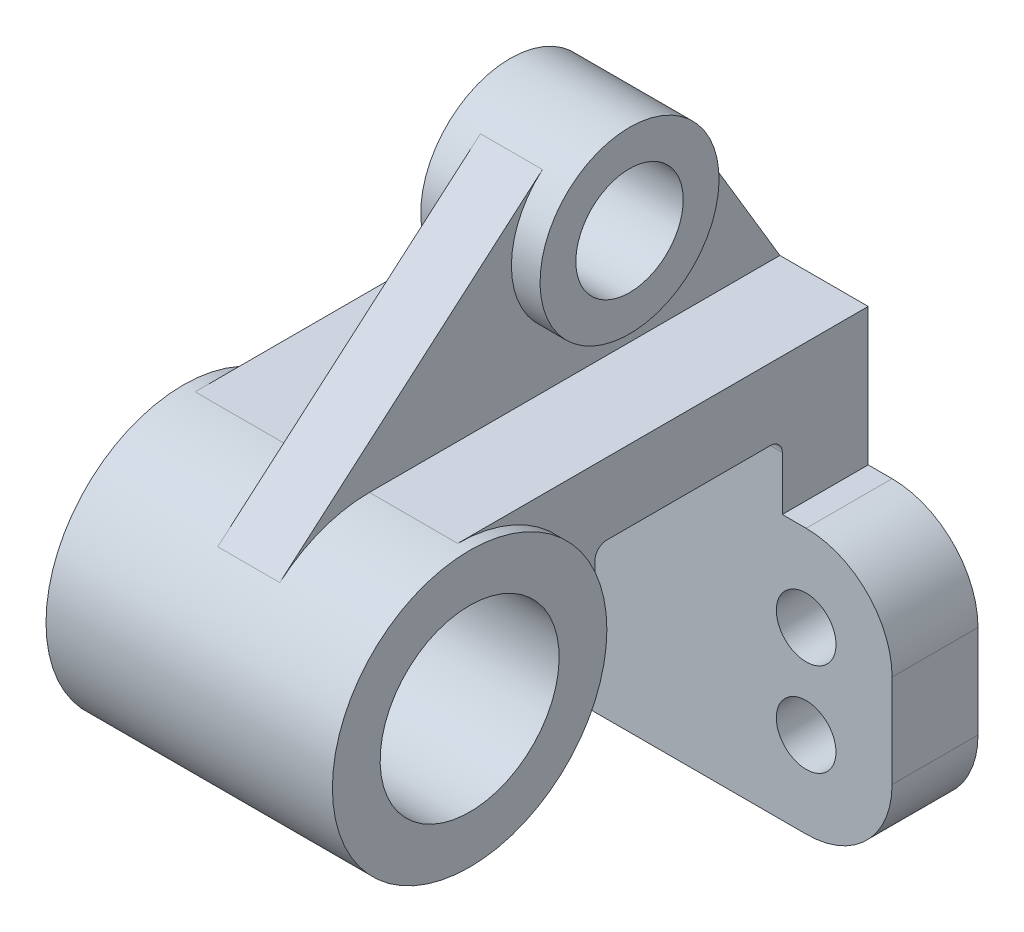
ISO-10303-21;
HEADER;
FILE_DESCRIPTION(('STEP AP214'),'2;1');
FILE_NAME('part.step','',(''),(''),'','','');
FILE_SCHEMA(('AUTOMOTIVE_DESIGN { 1 0 10303 214 1 1 1 1 }'));
ENDSEC;
DATA;
#1=APPLICATION_CONTEXT('core data for automotive mechanical design processes');
#2=APPLICATION_PROTOCOL_DEFINITION('international standard','automotive_design',2000,#1);
#3=PRODUCT_CONTEXT('',#1,'mechanical');
#4=PRODUCT('Part','Part','',(#3));
#5=PRODUCT_RELATED_PRODUCT_CATEGORY('part','',(#4));
#6=PRODUCT_DEFINITION_FORMATION('','',#4);
#7=PRODUCT_DEFINITION_CONTEXT('part definition',#1,'design');
#8=PRODUCT_DEFINITION('design','',#6,#7);
#9=PRODUCT_DEFINITION_SHAPE('','',#8);
#10=(LENGTH_UNIT() NAMED_UNIT(*) SI_UNIT(.MILLI.,.METRE.));
#11=(NAMED_UNIT(*) PLANE_ANGLE_UNIT() SI_UNIT($,.RADIAN.));
#12=(NAMED_UNIT(*) SI_UNIT($,.STERADIAN.) SOLID_ANGLE_UNIT());
#13=UNCERTAINTY_MEASURE_WITH_UNIT(LENGTH_MEASURE(1.E-05),#10,'distance_accuracy_value','');
#14=(GEOMETRIC_REPRESENTATION_CONTEXT(3) GLOBAL_UNCERTAINTY_ASSIGNED_CONTEXT((#13)) GLOBAL_UNIT_ASSIGNED_CONTEXT((#10,
#11,#12)) REPRESENTATION_CONTEXT('',''));
#15=CARTESIAN_POINT('',(0.,0.,0.));
#16=DIRECTION('',(0.,0.,1.));
#17=DIRECTION('',(1.,0.,0.));
#18=AXIS2_PLACEMENT_3D('',#15,#16,#17);
#19=CARTESIAN_POINT('',(-408.345479395829,-1118.04158059099,628.051528257977));
#20=DIRECTION('',(-1.,0.,0.));
#21=DIRECTION('',(0.,0.,1.));
#22=AXIS2_PLACEMENT_3D('',#19,#20,#21);
#23=PLANE('',#22);
#24=CARTESIAN_POINT('',(-408.345479395829,-1118.04158059099,628.051528257977));
#25=DIRECTION('',(-1.,0.,0.));
#26=DIRECTION('',(0.,-1.,0.));
#27=AXIS2_PLACEMENT_3D('',#24,#25,#26);
#28=CIRCLE('',#27,37.5);
#29=CARTESIAN_POINT('',(-408.345479395829,-1080.54158059099,628.051528257977));
#30=VERTEX_POINT('',#29);
#31=EDGE_CURVE('E181',#30,#30,#28,.T.);
#32=ORIENTED_EDGE('',*,*,#31,.F.);
#33=EDGE_LOOP('',(#32));
#34=FACE_BOUND('',#33,.T.);
#35=CARTESIAN_POINT('',(-408.345479395829,-1118.04158059099,628.051528257977));
#36=DIRECTION('',(1.,0.,0.));
#37=DIRECTION('',(0.,1.,0.));
#38=AXIS2_PLACEMENT_3D('',#35,#36,#37);
#39=CIRCLE('',#38,22.5);
#40=CARTESIAN_POINT('',(-408.345479395829,-1140.54158059099,628.051528257977));
#41=VERTEX_POINT('',#40);
#42=EDGE_CURVE('E10',#41,#41,#39,.T.);
#43=ORIENTED_EDGE('',*,*,#42,.F.);
#44=EDGE_LOOP('',(#43));
#45=FACE_BOUND('',#44,.T.);
#46=ADVANCED_FACE('F16',(#34,#45),#23,.F.);
#47=CARTESIAN_POINT('',(-458.345479395829,-1118.04158059099,628.051528257977));
#48=DIRECTION('',(-1.,0.,0.));
#49=DIRECTION('',(0.,0.,1.));
#50=AXIS2_PLACEMENT_3D('',#47,#48,#49);
#51=PLANE('',#50);
#52=CARTESIAN_POINT('',(-458.345479395829,-1118.04158059099,628.051528257977));
#53=DIRECTION('',(-1.,0.,0.));
#54=DIRECTION('',(0.,1.,0.));
#55=AXIS2_PLACEMENT_3D('',#52,#53,#54);
#56=CIRCLE('',#55,37.5);
#57=CARTESIAN_POINT('',(-458.345479395829,-1080.54158059099,628.051528257977));
#58=VERTEX_POINT('',#57);
#59=EDGE_CURVE('E180',#58,#58,#56,.T.);
#60=ORIENTED_EDGE('',*,*,#59,.T.);
#61=EDGE_LOOP('',(#60));
#62=FACE_BOUND('',#61,.T.);
#63=CARTESIAN_POINT('',(-458.345479395829,-1118.04158059099,628.051528257977));
#64=DIRECTION('',(1.,0.,0.));
#65=DIRECTION('',(0.,1.,0.));
#66=AXIS2_PLACEMENT_3D('',#63,#64,#65);
#67=CIRCLE('',#66,22.5);
#68=CARTESIAN_POINT('',(-458.345479395829,-1140.54158059099,628.051528257977));
#69=VERTEX_POINT('',#68);
#70=EDGE_CURVE('E25',#69,#69,#67,.T.);
#71=ORIENTED_EDGE('',*,*,#70,.T.);
#72=EDGE_LOOP('',(#71));
#73=FACE_BOUND('',#72,.T.);
#74=ADVANCED_FACE('F178',(#62,#73),#51,.T.);
#75=CARTESIAN_POINT('',(-408.345479395829,-1118.04158059099,628.051528257977));
#76=DIRECTION('',(1.,0.,0.));
#77=DIRECTION('',(0.,1.,0.));
#78=AXIS2_PLACEMENT_3D('',#75,#76,#77);
#79=CYLINDRICAL_SURFACE('',#78,22.5);
#80=ORIENTED_EDGE('',*,*,#42,.T.);
#81=EDGE_LOOP('',(#80));
#82=FACE_BOUND('',#81,.T.);
#83=ORIENTED_EDGE('',*,*,#70,.F.);
#84=EDGE_LOOP('',(#83));
#85=FACE_BOUND('',#84,.T.);
#86=ADVANCED_FACE('F555',(#82,#85),#79,.F.);
#87=CARTESIAN_POINT('',(-408.345479395829,-1118.04158059099,628.051528257977));
#88=DIRECTION('',(1.,0.,0.));
#89=DIRECTION('',(0.,-1.,0.));
#90=AXIS2_PLACEMENT_3D('',#87,#88,#89);
#91=CYLINDRICAL_SURFACE('',#90,37.5);
#92=DIRECTION('',(-1.,0.,0.));
#93=VECTOR('',#92,1.);
#94=CARTESIAN_POINT('',(-408.345479395829,-1089.63532876995,652.532844756065));
#95=LINE('',#94,#93);
#96=CARTESIAN_POINT('',(-420.345479395829,-1089.63532876995,652.532844756065));
#97=VERTEX_POINT('',#96);
#98=CARTESIAN_POINT('',(-446.345479395829,-1089.63532876995,652.532844756065));
#99=VERTEX_POINT('',#98);
#100=EDGE_CURVE('E196',#97,#99,#95,.T.);
#101=ORIENTED_EDGE('',*,*,#100,.F.);
#102=CARTESIAN_POINT('',(-420.345479395829,-1118.04158059099,628.051528257977));
#103=DIRECTION('',(1.,0.,0.));
#104=DIRECTION('',(0.,-1.,0.));
#105=AXIS2_PLACEMENT_3D('',#102,#103,#104);
#106=CIRCLE('',#105,37.5);
#107=CARTESIAN_POINT('',(-420.345479395829,-1098.82464587876,595.849673959415));
#108=VERTEX_POINT('',#107);
#109=EDGE_CURVE('E188',#97,#108,#106,.T.);
#110=ORIENTED_EDGE('',*,*,#109,.T.);
#111=DIRECTION('',(-1.,0.,0.));
#112=VECTOR('',#111,1.);
#113=CARTESIAN_POINT('',(-408.345479395829,-1098.82464587876,595.849673959415));
#114=LINE('',#113,#112);
#115=CARTESIAN_POINT('',(-446.345479395829,-1098.82464587876,595.849673959415));
#116=VERTEX_POINT('',#115);
#117=EDGE_CURVE('E274',#108,#116,#114,.T.);
#118=ORIENTED_EDGE('',*,*,#117,.T.);
#119=CARTESIAN_POINT('',(-446.345479395829,-1118.04158059099,628.051528257977));
#120=DIRECTION('',(-1.,0.,0.));
#121=DIRECTION('',(0.,-1.,0.));
#122=AXIS2_PLACEMENT_3D('',#119,#120,#121);
#123=CIRCLE('',#122,37.5);
#124=EDGE_CURVE('E191',#116,#99,#123,.T.);
#125=ORIENTED_EDGE('',*,*,#124,.T.);
#126=EDGE_LOOP('',(#101,#110,#118,#125));
#127=FACE_BOUND('',#126,.T.);
#128=ORIENTED_EDGE('',*,*,#59,.F.);
#129=EDGE_LOOP('',(#128));
#130=FACE_BOUND('',#129,.T.);
#131=ORIENTED_EDGE('',*,*,#31,.T.);
#132=EDGE_LOOP('',(#131));
#133=FACE_BOUND('',#132,.T.);
#134=ADVANCED_FACE('F556',(#127,#130,#133),#91,.T.);
#135=CARTESIAN_POINT('',(-420.345479395829,-1147.60960612174,650.948440116478));
#136=DIRECTION('',(1.,0.,0.));
#137=DIRECTION('',(0.,0.,-1.));
#138=AXIS2_PLACEMENT_3D('',#135,#136,#137);
#139=PLANE('',#138);
#140=CARTESIAN_POINT('',(-420.345479395829,-1228.041580591,725.051528257977));
#141=DIRECTION('',(1.,0.,0.));
#142=DIRECTION('',(0.,1.,0.));
#143=AXIS2_PLACEMENT_3D('',#140,#141,#142);
#144=CIRCLE('',#143,57.5000000000011);
#145=CARTESIAN_POINT('',(-420.345479395829,-1170.54158059099,725.051528257977));
#146=VERTEX_POINT('',#145);
#147=CARTESIAN_POINT('',(-420.345479395829,-1184.48532779873,762.589546888379));
#148=VERTEX_POINT('',#147);
#149=EDGE_CURVE('E288',#146,#148,#144,.T.);
#150=ORIENTED_EDGE('',*,*,#149,.F.);
#151=DIRECTION('',(0.,0.,1.));
#152=VECTOR('',#151,1.);
#153=CARTESIAN_POINT('',(-420.345479395829,-1170.54158059099,553.051528257977));
#154=LINE('',#153,#152);
#155=CARTESIAN_POINT('',(-420.345479395829,-1170.54158059099,553.051528257977));
#156=VERTEX_POINT('',#155);
#157=EDGE_CURVE('E267',#156,#146,#154,.T.);
#158=ORIENTED_EDGE('',*,*,#157,.F.);
#159=DIRECTION('',(0.,-0.858716114628324,-0.512451592326178));
#160=VECTOR('',#159,1.);
#161=CARTESIAN_POINT('',(-420.345479395829,-1098.82464587876,595.849673959415));
#162=LINE('',#161,#160);
#163=EDGE_CURVE('E339',#108,#156,#162,.T.);
#164=ORIENTED_EDGE('',*,*,#163,.F.);
#165=ORIENTED_EDGE('',*,*,#109,.F.);
#166=DIRECTION('',(0.,0.65283510661569,-0.757500048561108));
#167=VECTOR('',#166,1.);
#168=CARTESIAN_POINT('',(-420.345479395829,-1184.48532779873,762.589546888379));
#169=LINE('',#168,#167);
#170=EDGE_CURVE('E205',#148,#97,#169,.T.);
#171=ORIENTED_EDGE('',*,*,#170,.F.);
#172=EDGE_LOOP('',(#150,#158,#164,#165,#171));
#173=FACE_BOUND('',#172,.T.);
#174=ADVANCED_FACE('F559',(#173),#139,.T.);
#175=CARTESIAN_POINT('',(-446.345479395829,-1147.60960612174,650.948440116478));
#176=DIRECTION('',(1.,0.,0.));
#177=DIRECTION('',(0.,0.,-1.));
#178=AXIS2_PLACEMENT_3D('',#175,#176,#177);
#179=PLANE('',#178);
#180=CARTESIAN_POINT('',(-446.345479395829,-1228.041580591,725.051528257977));
#181=DIRECTION('',(1.,0.,0.));
#182=DIRECTION('',(0.,1.,0.));
#183=AXIS2_PLACEMENT_3D('',#180,#181,#182);
#184=CIRCLE('',#183,57.5000000000011);
#185=CARTESIAN_POINT('',(-446.345479395829,-1170.54158059099,725.051528257977));
#186=VERTEX_POINT('',#185);
#187=CARTESIAN_POINT('',(-446.345479395829,-1184.48532779873,762.589546888379));
#188=VERTEX_POINT('',#187);
#189=EDGE_CURVE('E313',#186,#188,#184,.T.);
#190=ORIENTED_EDGE('',*,*,#189,.T.);
#191=DIRECTION('',(0.,0.65283510661569,-0.757500048561108));
#192=VECTOR('',#191,1.);
#193=CARTESIAN_POINT('',(-446.345479395829,-1184.48532779873,762.589546888379));
#194=LINE('',#193,#192);
#195=EDGE_CURVE('E197',#188,#99,#194,.T.);
#196=ORIENTED_EDGE('',*,*,#195,.T.);
#197=ORIENTED_EDGE('',*,*,#124,.F.);
#198=DIRECTION('',(0.,-0.858716114628324,-0.512451592326178));
#199=VECTOR('',#198,1.);
#200=CARTESIAN_POINT('',(-446.345479395829,-1098.82464587876,595.849673959415));
#201=LINE('',#200,#199);
#202=CARTESIAN_POINT('',(-446.345479395829,-1170.54158059099,553.051528257977));
#203=VERTEX_POINT('',#202);
#204=EDGE_CURVE('E384',#116,#203,#201,.T.);
#205=ORIENTED_EDGE('',*,*,#204,.T.);
#206=DIRECTION('',(0.,0.,1.));
#207=VECTOR('',#206,1.);
#208=CARTESIAN_POINT('',(-446.345479395829,-1170.54158059099,553.051528257977));
#209=LINE('',#208,#207);
#210=EDGE_CURVE('E279',#203,#186,#209,.T.);
#211=ORIENTED_EDGE('',*,*,#210,.T.);
#212=EDGE_LOOP('',(#190,#196,#197,#205,#211));
#213=FACE_BOUND('',#212,.T.);
#214=ADVANCED_FACE('F562',(#213),#179,.F.);
#215=CARTESIAN_POINT('',(-420.345479395829,-1184.48532779873,762.589546888379));
#216=DIRECTION('',(0.,0.757500048561107,0.65283510661569));
#217=DIRECTION('',(0.,0.65283510661569,-0.757500048561107));
#218=AXIS2_PLACEMENT_3D('',#215,#216,#217);
#219=PLANE('',#218);
#220=ORIENTED_EDGE('',*,*,#170,.T.);
#221=ORIENTED_EDGE('',*,*,#100,.T.);
#222=ORIENTED_EDGE('',*,*,#195,.F.);
#223=DIRECTION('',(-1.,0.,0.));
#224=VECTOR('',#223,1.);
#225=CARTESIAN_POINT('',(-420.345479395829,-1184.48532779873,762.589546888379));
#226=LINE('',#225,#224);
#227=EDGE_CURVE('E312',#148,#188,#226,.T.);
#228=ORIENTED_EDGE('',*,*,#227,.F.);
#229=EDGE_LOOP('',(#220,#221,#222,#228));
#230=FACE_BOUND('',#229,.T.);
#231=ADVANCED_FACE('F569',(#230),#219,.T.);
#232=CARTESIAN_POINT('',(-420.345479395829,-1098.82464587876,595.849673959415));
#233=DIRECTION('',(0.,0.512451592326178,-0.858716114628324));
#234=DIRECTION('',(0.,-0.858716114628324,-0.512451592326178));
#235=AXIS2_PLACEMENT_3D('',#232,#233,#234);
#236=PLANE('',#235);
#237=ORIENTED_EDGE('',*,*,#163,.T.);
#238=DIRECTION('',(-1.,0.,0.));
#239=VECTOR('',#238,1.);
#240=CARTESIAN_POINT('',(-420.345479395829,-1170.54158059099,553.051528257977));
#241=LINE('',#240,#239);
#242=EDGE_CURVE('E349',#156,#203,#241,.T.);
#243=ORIENTED_EDGE('',*,*,#242,.T.);
#244=ORIENTED_EDGE('',*,*,#204,.F.);
#245=ORIENTED_EDGE('',*,*,#117,.F.);
#246=EDGE_LOOP('',(#237,#243,#244,#245));
#247=FACE_BOUND('',#246,.T.);
#248=ADVANCED_FACE('F572',(#247),#236,.T.);
#249=CARTESIAN_POINT('',(-337.345479395829,-1339.04158059099,553.051528257977));
#250=DIRECTION('',(0.,-1.,0.));
#251=DIRECTION('',(0.,0.,1.));
#252=AXIS2_PLACEMENT_3D('',#249,#250,#251);
#253=PLANE('',#252);
#254=DIRECTION('',(0.,0.,-1.));
#255=VECTOR('',#254,1.);
#256=CARTESIAN_POINT('',(-373.345479395829,-1339.04158059099,562.051528257977));
#257=LINE('',#256,#255);
#258=CARTESIAN_POINT('',(-373.345479395829,-1339.04158059099,589.051528257977));
#259=VERTEX_POINT('',#258);
#260=CARTESIAN_POINT('',(-373.345479395829,-1339.04158059099,553.051528257977));
#261=VERTEX_POINT('',#260);
#262=EDGE_CURVE('E219',#259,#261,#257,.T.);
#263=ORIENTED_EDGE('',*,*,#262,.F.);
#264=DIRECTION('',(-1.,0.,0.));
#265=VECTOR('',#264,1.);
#266=CARTESIAN_POINT('',(-337.345479395829,-1339.04158059099,589.051528257977));
#267=LINE('',#266,#265);
#268=CARTESIAN_POINT('',(-493.345479395829,-1339.04158059099,589.051528257977));
#269=VERTEX_POINT('',#268);
#270=EDGE_CURVE('E210',#259,#269,#267,.T.);
#271=ORIENTED_EDGE('',*,*,#270,.T.);
#272=DIRECTION('',(0.,0.,1.));
#273=VECTOR('',#272,1.);
#274=CARTESIAN_POINT('',(-493.345479395829,-1339.04158059099,562.051528257977));
#275=LINE('',#274,#273);
#276=CARTESIAN_POINT('',(-493.345479395829,-1339.04158059099,553.051528257977));
#277=VERTEX_POINT('',#276);
#278=EDGE_CURVE('E206',#277,#269,#275,.T.);
#279=ORIENTED_EDGE('',*,*,#278,.F.);
#280=DIRECTION('',(-1.,0.,0.));
#281=VECTOR('',#280,1.);
#282=CARTESIAN_POINT('',(-337.345479395829,-1339.04158059099,553.051528257977));
#283=LINE('',#282,#281);
#284=EDGE_CURVE('E386',#261,#277,#283,.T.);
#285=ORIENTED_EDGE('',*,*,#284,.F.);
#286=EDGE_LOOP('',(#263,#271,#279,#285));
#287=FACE_BOUND('',#286,.T.);
#288=ADVANCED_FACE('F580',(#287),#253,.T.);
#289=CARTESIAN_POINT('',(-337.345479395829,-1228.04158059099,589.051528257977));
#290=DIRECTION('',(0.,1.,0.));
#291=DIRECTION('',(0.,0.,-1.));
#292=AXIS2_PLACEMENT_3D('',#289,#290,#291);
#293=PLANE('',#292);
#294=DIRECTION('',(0.,0.,1.));
#295=VECTOR('',#294,1.);
#296=CARTESIAN_POINT('',(-373.345479395829,-1228.04158059099,580.051528257977));
#297=LINE('',#296,#295);
#298=CARTESIAN_POINT('',(-373.345479395829,-1228.04158059099,553.051528257977));
#299=VERTEX_POINT('',#298);
#300=CARTESIAN_POINT('',(-373.345479395829,-1228.04158059099,589.051528257977));
#301=VERTEX_POINT('',#300);
#302=EDGE_CURVE('E414',#299,#301,#297,.T.);
#303=ORIENTED_EDGE('',*,*,#302,.F.);
#304=DIRECTION('',(-1.,0.,0.));
#305=VECTOR('',#304,1.);
#306=CARTESIAN_POINT('',(-337.345479395829,-1228.04158059099,553.051528257977));
#307=LINE('',#306,#305);
#308=CARTESIAN_POINT('',(-383.345479395829,-1228.04158059099,553.051528257977));
#309=VERTEX_POINT('',#308);
#310=EDGE_CURVE('E333',#299,#309,#307,.T.);
#311=ORIENTED_EDGE('',*,*,#310,.T.);
#312=DIRECTION('',(0.,0.,1.));
#313=VECTOR('',#312,1.);
#314=CARTESIAN_POINT('',(-383.345479395829,-1228.04158059099,608.169832847086));
#315=LINE('',#314,#313);
#316=CARTESIAN_POINT('',(-383.345479395829,-1228.04158059099,589.051528257977));
#317=VERTEX_POINT('',#316);
#318=EDGE_CURVE('E222',#309,#317,#315,.T.);
#319=ORIENTED_EDGE('',*,*,#318,.T.);
#320=DIRECTION('',(-1.,0.,0.));
#321=VECTOR('',#320,1.);
#322=CARTESIAN_POINT('',(-337.345479395829,-1228.04158059099,589.051528257977));
#323=LINE('',#322,#321);
#324=EDGE_CURVE('E215',#301,#317,#323,.T.);
#325=ORIENTED_EDGE('',*,*,#324,.F.);
#326=EDGE_LOOP('',(#303,#311,#319,#325));
#327=FACE_BOUND('',#326,.T.);
#328=ADVANCED_FACE('F583',(#327),#293,.T.);
#329=CARTESIAN_POINT('',(-493.345479395829,-1303.04158059099,562.051528257977));
#330=DIRECTION('',(0.,0.,-1.));
#331=DIRECTION('',(-0.707106781186548,-0.707106781186548,0.));
#332=AXIS2_PLACEMENT_3D('',#329,#330,#331);
#333=CYLINDRICAL_SURFACE('',#332,36.);
#334=CARTESIAN_POINT('',(-493.345479395829,-1303.04158059099,589.051528257977));
#335=DIRECTION('',(0.,0.,-1.));
#336=DIRECTION('',(-0.707106781186548,-0.707106781186548,0.));
#337=AXIS2_PLACEMENT_3D('',#334,#335,#336);
#338=CIRCLE('',#337,36.);
#339=CARTESIAN_POINT('',(-529.345479395829,-1303.04158059099,589.051528257977));
#340=VERTEX_POINT('',#339);
#341=EDGE_CURVE('E211',#269,#340,#338,.T.);
#342=ORIENTED_EDGE('',*,*,#341,.T.);
#343=DIRECTION('',(0.,0.,-1.));
#344=VECTOR('',#343,1.);
#345=CARTESIAN_POINT('',(-529.345479395829,-1303.04158059099,562.051528257977));
#346=LINE('',#345,#344);
#347=CARTESIAN_POINT('',(-529.345479395829,-1303.04158059099,553.051528257977));
#348=VERTEX_POINT('',#347);
#349=EDGE_CURVE('E201',#340,#348,#346,.T.);
#350=ORIENTED_EDGE('',*,*,#349,.T.);
#351=CARTESIAN_POINT('',(-493.345479395829,-1303.04158059099,553.051528257977));
#352=DIRECTION('',(0.,0.,1.));
#353=DIRECTION('',(-0.707106781186548,-0.707106781186548,0.));
#354=AXIS2_PLACEMENT_3D('',#351,#352,#353);
#355=CIRCLE('',#354,36.);
#356=EDGE_CURVE('E381',#348,#277,#355,.T.);
#357=ORIENTED_EDGE('',*,*,#356,.T.);
#358=ORIENTED_EDGE('',*,*,#278,.T.);
#359=EDGE_LOOP('',(#342,#350,#357,#358));
#360=FACE_BOUND('',#359,.T.);
#361=ADVANCED_FACE('F584',(#360),#333,.T.);
#362=CARTESIAN_POINT('',(-529.345479395829,-1283.54158059099,571.051528257977));
#363=DIRECTION('',(-1.,0.,0.));
#364=DIRECTION('',(0.,0.,1.));
#365=AXIS2_PLACEMENT_3D('',#362,#363,#364);
#366=PLANE('',#365);
#367=DIRECTION('',(0.,0.,1.));
#368=VECTOR('',#367,1.);
#369=CARTESIAN_POINT('',(-529.345479395829,-1264.04158059099,580.051528257977));
#370=LINE('',#369,#368);
#371=CARTESIAN_POINT('',(-529.345479395829,-1264.04158059099,553.051528257977));
#372=VERTEX_POINT('',#371);
#373=CARTESIAN_POINT('',(-529.345479395829,-1264.04158059099,589.051528257977));
#374=VERTEX_POINT('',#373);
#375=EDGE_CURVE('E216',#372,#374,#370,.T.);
#376=ORIENTED_EDGE('',*,*,#375,.F.);
#377=DIRECTION('',(0.,-1.,0.));
#378=VECTOR('',#377,1.);
#379=CARTESIAN_POINT('',(-529.345479395829,-1228.04158059099,553.051528257977));
#380=LINE('',#379,#378);
#381=EDGE_CURVE('E374',#372,#348,#380,.T.);
#382=ORIENTED_EDGE('',*,*,#381,.T.);
#383=ORIENTED_EDGE('',*,*,#349,.F.);
#384=DIRECTION('',(0.,1.,0.));
#385=VECTOR('',#384,1.);
#386=CARTESIAN_POINT('',(-529.345479395829,-1339.04158059099,589.051528257977));
#387=LINE('',#386,#385);
#388=EDGE_CURVE('E208',#340,#374,#387,.T.);
#389=ORIENTED_EDGE('',*,*,#388,.T.);
#390=EDGE_LOOP('',(#376,#382,#383,#389));
#391=FACE_BOUND('',#390,.T.);
#392=ADVANCED_FACE('F589',(#391),#366,.T.);
#393=CARTESIAN_POINT('',(-337.345479395829,-1339.04158059099,589.051528257977));
#394=DIRECTION('',(0.,0.,1.));
#395=DIRECTION('',(0.,1.,0.));
#396=AXIS2_PLACEMENT_3D('',#393,#394,#395);
#397=PLANE('',#396);
#398=CARTESIAN_POINT('',(-373.345479395829,-1264.04158059099,589.051528257977));
#399=DIRECTION('',(0.,0.,-1.));
#400=DIRECTION('',(0.707106781186548,0.707106781186548,0.));
#401=AXIS2_PLACEMENT_3D('',#398,#399,#400);
#402=CIRCLE('',#401,36.);
#403=CARTESIAN_POINT('',(-337.345479395829,-1264.04158059099,589.051528257977));
#404=VERTEX_POINT('',#403);
#405=EDGE_CURVE('E406',#301,#404,#402,.T.);
#406=ORIENTED_EDGE('',*,*,#405,.F.);
#407=ORIENTED_EDGE('',*,*,#324,.T.);
#408=DIRECTION('',(0.,1.,0.));
#409=VECTOR('',#408,1.);
#410=CARTESIAN_POINT('',(-383.345479395829,-1228.04158059099,589.051528257977));
#411=LINE('',#410,#409);
#412=CARTESIAN_POINT('',(-383.345479395829,-1205.54158059099,589.051528257977));
#413=VERTEX_POINT('',#412);
#414=EDGE_CURVE('E226',#317,#413,#411,.T.);
#415=ORIENTED_EDGE('',*,*,#414,.T.);
#416=DIRECTION('',(-1.,0.,0.));
#417=VECTOR('',#416,1.);
#418=CARTESIAN_POINT('',(-383.345479395829,-1205.54158059099,589.051528257977));
#419=LINE('',#418,#417);
#420=CARTESIAN_POINT('',(-493.345479395829,-1205.54158059099,589.051528257977));
#421=VERTEX_POINT('',#420);
#422=EDGE_CURVE('E230',#413,#421,#419,.T.);
#423=ORIENTED_EDGE('',*,*,#422,.T.);
#424=DIRECTION('',(0.,1.,0.));
#425=VECTOR('',#424,1.);
#426=CARTESIAN_POINT('',(-493.345479395829,-1228.04158059099,589.051528257977));
#427=LINE('',#426,#425);
#428=CARTESIAN_POINT('',(-493.345479395829,-1228.04158059099,589.051528257977));
#429=VERTEX_POINT('',#428);
#430=EDGE_CURVE('E228',#429,#421,#427,.T.);
#431=ORIENTED_EDGE('',*,*,#430,.F.);
#432=CARTESIAN_POINT('',(-493.345479395829,-1264.04158059099,589.051528257977));
#433=DIRECTION('',(0.,0.,-1.));
#434=DIRECTION('',(-0.707106781186548,0.707106781186548,0.));
#435=AXIS2_PLACEMENT_3D('',#432,#433,#434);
#436=CIRCLE('',#435,36.);
#437=EDGE_CURVE('E213',#374,#429,#436,.T.);
#438=ORIENTED_EDGE('',*,*,#437,.F.);
#439=ORIENTED_EDGE('',*,*,#388,.F.);
#440=ORIENTED_EDGE('',*,*,#341,.F.);
#441=ORIENTED_EDGE('',*,*,#270,.F.);
#442=CARTESIAN_POINT('',(-373.345479395829,-1303.04158059099,589.051528257977));
#443=DIRECTION('',(0.,0.,-1.));
#444=DIRECTION('',(0.707106781186548,-0.707106781186548,0.));
#445=AXIS2_PLACEMENT_3D('',#442,#443,#444);
#446=CIRCLE('',#445,36.);
#447=CARTESIAN_POINT('',(-337.345479395829,-1303.04158059099,589.051528257977));
#448=VERTEX_POINT('',#447);
#449=EDGE_CURVE('E223',#448,#259,#446,.T.);
#450=ORIENTED_EDGE('',*,*,#449,.F.);
#451=DIRECTION('',(0.,1.,0.));
#452=VECTOR('',#451,1.);
#453=CARTESIAN_POINT('',(-337.345479395829,-1339.04158059099,589.051528257977));
#454=LINE('',#453,#452);
#455=EDGE_CURVE('E332',#448,#404,#454,.T.);
#456=ORIENTED_EDGE('',*,*,#455,.T.);
#457=EDGE_LOOP('',(#406,#407,#415,#423,#431,#438,#439,#440,#441,#450,#456));
#458=FACE_BOUND('',#457,.T.);
#459=CARTESIAN_POINT('',(-373.345479395829,-1303.04158059099,589.051528257977));
#460=DIRECTION('',(0.,0.,-1.));
#461=DIRECTION('',(-1.,0.,0.));
#462=AXIS2_PLACEMENT_3D('',#459,#460,#461);
#463=CIRCLE('',#462,12.5);
#464=CARTESIAN_POINT('',(-385.845479395829,-1303.04158059099,589.051528257977));
#465=VERTEX_POINT('',#464);
#466=EDGE_CURVE('E411',#465,#465,#463,.T.);
#467=ORIENTED_EDGE('',*,*,#466,.T.);
#468=EDGE_LOOP('',(#467));
#469=FACE_BOUND('',#468,.T.);
#470=CARTESIAN_POINT('',(-493.345479395829,-1303.04158059099,589.051528257977));
#471=DIRECTION('',(0.,0.,-1.));
#472=DIRECTION('',(0.,1.,0.));
#473=AXIS2_PLACEMENT_3D('',#470,#471,#472);
#474=CIRCLE('',#473,12.5);
#475=CARTESIAN_POINT('',(-493.345479395829,-1290.54158059099,589.051528257977));
#476=VERTEX_POINT('',#475);
#477=EDGE_CURVE('E417',#476,#476,#474,.T.);
#478=ORIENTED_EDGE('',*,*,#477,.T.);
#479=EDGE_LOOP('',(#478));
#480=FACE_BOUND('',#479,.T.);
#481=CARTESIAN_POINT('',(-373.345479395829,-1264.04158059099,589.051528257977));
#482=DIRECTION('',(0.,0.,-1.));
#483=DIRECTION('',(0.,1.,0.));
#484=AXIS2_PLACEMENT_3D('',#481,#482,#483);
#485=CIRCLE('',#484,12.5);
#486=CARTESIAN_POINT('',(-373.345479395829,-1251.54158059099,589.051528257977));
#487=VERTEX_POINT('',#486);
#488=EDGE_CURVE('E428',#487,#487,#485,.T.);
#489=ORIENTED_EDGE('',*,*,#488,.T.);
#490=EDGE_LOOP('',(#489));
#491=FACE_BOUND('',#490,.T.);
#492=CARTESIAN_POINT('',(-493.345479395829,-1264.04158059099,589.051528257977));
#493=DIRECTION('',(0.,0.,-1.));
#494=DIRECTION('',(0.,1.,0.));
#495=AXIS2_PLACEMENT_3D('',#492,#493,#494);
#496=CIRCLE('',#495,12.5);
#497=CARTESIAN_POINT('',(-493.345479395829,-1251.54158059099,589.051528257977));
#498=VERTEX_POINT('',#497);
#499=EDGE_CURVE('E445',#498,#498,#496,.T.);
#500=ORIENTED_EDGE('',*,*,#499,.T.);
#501=EDGE_LOOP('',(#500));
#502=FACE_BOUND('',#501,.T.);
#503=ADVANCED_FACE('F472',(#458,#469,#480,#491,#502),#397,.T.);
#504=CARTESIAN_POINT('',(-493.345479395829,-1264.04158059099,580.051528257977));
#505=DIRECTION('',(0.,0.,1.));
#506=DIRECTION('',(-0.707106781186548,0.707106781186548,0.));
#507=AXIS2_PLACEMENT_3D('',#504,#505,#506);
#508=CYLINDRICAL_SURFACE('',#507,36.);
#509=CARTESIAN_POINT('',(-493.345479395829,-1264.04158059099,553.051528257977));
#510=DIRECTION('',(0.,0.,1.));
#511=DIRECTION('',(-0.707106781186548,0.707106781186548,0.));
#512=AXIS2_PLACEMENT_3D('',#509,#510,#511);
#513=CIRCLE('',#512,36.);
#514=CARTESIAN_POINT('',(-493.345479395829,-1228.04158059099,553.051528257977));
#515=VERTEX_POINT('',#514);
#516=EDGE_CURVE('E368',#515,#372,#513,.T.);
#517=ORIENTED_EDGE('',*,*,#516,.T.);
#518=ORIENTED_EDGE('',*,*,#375,.T.);
#519=ORIENTED_EDGE('',*,*,#437,.T.);
#520=DIRECTION('',(0.,0.,-1.));
#521=VECTOR('',#520,1.);
#522=CARTESIAN_POINT('',(-493.345479395829,-1228.04158059099,580.051528257977));
#523=LINE('',#522,#521);
#524=EDGE_CURVE('E232',#429,#515,#523,.T.);
#525=ORIENTED_EDGE('',*,*,#524,.T.);
#526=EDGE_LOOP('',(#517,#518,#519,#525));
#527=FACE_BOUND('',#526,.T.);
#528=ADVANCED_FACE('F596',(#527),#508,.T.);
#529=CARTESIAN_POINT('',(-373.345479395829,-1303.04158059099,562.051528257977));
#530=DIRECTION('',(0.,0.,-1.));
#531=DIRECTION('',(0.707106781186548,-0.707106781186548,0.));
#532=AXIS2_PLACEMENT_3D('',#529,#530,#531);
#533=CYLINDRICAL_SURFACE('',#532,36.);
#534=ORIENTED_EDGE('',*,*,#449,.T.);
#535=ORIENTED_EDGE('',*,*,#262,.T.);
#536=CARTESIAN_POINT('',(-373.345479395829,-1303.04158059099,553.051528257977));
#537=DIRECTION('',(0.,0.,1.));
#538=DIRECTION('',(0.707106781186548,-0.707106781186548,0.));
#539=AXIS2_PLACEMENT_3D('',#536,#537,#538);
#540=CIRCLE('',#539,36.);
#541=CARTESIAN_POINT('',(-337.345479395829,-1303.04158059099,553.051528257977));
#542=VERTEX_POINT('',#541);
#543=EDGE_CURVE('E395',#261,#542,#540,.T.);
#544=ORIENTED_EDGE('',*,*,#543,.T.);
#545=DIRECTION('',(0.,0.,1.));
#546=VECTOR('',#545,1.);
#547=CARTESIAN_POINT('',(-337.345479395829,-1303.04158059099,562.051528257977));
#548=LINE('',#547,#546);
#549=EDGE_CURVE('E324',#542,#448,#548,.T.);
#550=ORIENTED_EDGE('',*,*,#549,.T.);
#551=EDGE_LOOP('',(#534,#535,#544,#550));
#552=FACE_BOUND('',#551,.T.);
#553=ADVANCED_FACE('F597',(#552),#533,.T.);
#554=CARTESIAN_POINT('',(-383.345479395829,-1191.58661970908,627.288137436196));
#555=DIRECTION('',(1.,0.,0.));
#556=DIRECTION('',(0.,0.,-1.));
#557=AXIS2_PLACEMENT_3D('',#554,#555,#556);
#558=PLANE('',#557);
#559=DIRECTION('',(0.,-1.,0.));
#560=VECTOR('',#559,1.);
#561=CARTESIAN_POINT('',(-383.345479395829,-1170.54158059099,553.051528257977));
#562=LINE('',#561,#560);
#563=CARTESIAN_POINT('',(-383.345479395829,-1170.54158059099,553.051528257977));
#564=VERTEX_POINT('',#563);
#565=EDGE_CURVE('E341',#564,#309,#562,.T.);
#566=ORIENTED_EDGE('',*,*,#565,.F.);
#567=DIRECTION('',(0.,0.,-1.));
#568=VECTOR('',#567,1.);
#569=CARTESIAN_POINT('',(-383.345479395829,-1170.54158059099,725.051528257977));
#570=LINE('',#569,#568);
#571=CARTESIAN_POINT('',(-383.345479395829,-1170.54158059099,725.051528257977));
#572=VERTEX_POINT('',#571);
#573=EDGE_CURVE('E263',#572,#564,#570,.T.);
#574=ORIENTED_EDGE('',*,*,#573,.F.);
#575=CARTESIAN_POINT('',(-383.345479395829,-1228.04158059099,725.051528257977));
#576=DIRECTION('',(1.,0.,0.));
#577=DIRECTION('',(0.,0.,-1.));
#578=AXIS2_PLACEMENT_3D('',#575,#576,#577);
#579=CIRCLE('',#578,57.5);
#580=CARTESIAN_POINT('',(-383.345479395829,-1228.04158059099,667.551528257977));
#581=VERTEX_POINT('',#580);
#582=EDGE_CURVE('E297',#581,#572,#579,.T.);
#583=ORIENTED_EDGE('',*,*,#582,.F.);
#584=DIRECTION('',(0.,-1.,0.));
#585=VECTOR('',#584,1.);
#586=CARTESIAN_POINT('',(-383.345479395829,-1205.54158059099,667.551528257977));
#587=LINE('',#586,#585);
#588=CARTESIAN_POINT('',(-383.345479395829,-1205.54158059099,667.551528257977));
#589=VERTEX_POINT('',#588);
#590=EDGE_CURVE('E257',#589,#581,#587,.T.);
#591=ORIENTED_EDGE('',*,*,#590,.F.);
#592=CARTESIAN_POINT('',(-383.345479395829,-1205.541580591,662.551528257977));
#593=DIRECTION('',(1.,0.,0.));
#594=DIRECTION('',(0.,1.,0.));
#595=AXIS2_PLACEMENT_3D('',#592,#593,#594);
#596=CIRCLE('',#595,5.00000000000046);
#597=CARTESIAN_POINT('',(-383.345479395829,-1200.54158059099,662.551528257977));
#598=VERTEX_POINT('',#597);
#599=EDGE_CURVE('E258',#598,#589,#596,.T.);
#600=ORIENTED_EDGE('',*,*,#599,.F.);
#601=DIRECTION('',(0.,0.,1.));
#602=VECTOR('',#601,1.);
#603=CARTESIAN_POINT('',(-383.345479395829,-1200.54158059099,594.051528257977));
#604=LINE('',#603,#602);
#605=CARTESIAN_POINT('',(-383.345479395829,-1200.541580591,594.051528257977));
#606=VERTEX_POINT('',#605);
#607=EDGE_CURVE('E249',#606,#598,#604,.T.);
#608=ORIENTED_EDGE('',*,*,#607,.F.);
#609=CARTESIAN_POINT('',(-383.345479395829,-1205.541580591,594.051528257977));
#610=DIRECTION('',(1.,0.,0.));
#611=DIRECTION('',(0.,0.,-1.));
#612=AXIS2_PLACEMENT_3D('',#609,#610,#611);
#613=CIRCLE('',#612,4.99999999999989);
#614=EDGE_CURVE('E238',#413,#606,#613,.T.);
#615=ORIENTED_EDGE('',*,*,#614,.F.);
#616=ORIENTED_EDGE('',*,*,#414,.F.);
#617=ORIENTED_EDGE('',*,*,#318,.F.);
#618=EDGE_LOOP('',(#566,#574,#583,#591,#600,#608,#615,#616,#617));
#619=FACE_BOUND('',#618,.T.);
#620=ADVANCED_FACE('F602',(#619),#558,.T.);
#621=CARTESIAN_POINT('',(-493.345479395829,-1191.58661970908,627.288137436196));
#622=DIRECTION('',(1.,0.,0.));
#623=DIRECTION('',(0.,0.,-1.));
#624=AXIS2_PLACEMENT_3D('',#621,#622,#623);
#625=PLANE('',#624);
#626=DIRECTION('',(0.,-1.,0.));
#627=VECTOR('',#626,1.);
#628=CARTESIAN_POINT('',(-493.345479395829,-1170.54158059099,553.051528257977));
#629=LINE('',#628,#627);
#630=CARTESIAN_POINT('',(-493.345479395829,-1170.54158059099,553.051528257977));
#631=VERTEX_POINT('',#630);
#632=EDGE_CURVE('E359',#631,#515,#629,.T.);
#633=ORIENTED_EDGE('',*,*,#632,.T.);
#634=ORIENTED_EDGE('',*,*,#524,.F.);
#635=ORIENTED_EDGE('',*,*,#430,.T.);
#636=CARTESIAN_POINT('',(-493.345479395829,-1205.541580591,594.051528257977));
#637=DIRECTION('',(1.,0.,0.));
#638=DIRECTION('',(0.,0.,-1.));
#639=AXIS2_PLACEMENT_3D('',#636,#637,#638);
#640=CIRCLE('',#639,4.99999999999989);
#641=CARTESIAN_POINT('',(-493.345479395829,-1200.541580591,594.051528257977));
#642=VERTEX_POINT('',#641);
#643=EDGE_CURVE('E234',#421,#642,#640,.T.);
#644=ORIENTED_EDGE('',*,*,#643,.T.);
#645=DIRECTION('',(0.,0.,1.));
#646=VECTOR('',#645,1.);
#647=CARTESIAN_POINT('',(-493.345479395829,-1200.54158059099,594.051528257977));
#648=LINE('',#647,#646);
#649=CARTESIAN_POINT('',(-493.345479395829,-1200.54158059099,662.551528257977));
#650=VERTEX_POINT('',#649);
#651=EDGE_CURVE('E244',#642,#650,#648,.T.);
#652=ORIENTED_EDGE('',*,*,#651,.T.);
#653=CARTESIAN_POINT('',(-493.345479395829,-1205.541580591,662.551528257977));
#654=DIRECTION('',(1.,0.,0.));
#655=DIRECTION('',(0.,1.,0.));
#656=AXIS2_PLACEMENT_3D('',#653,#654,#655);
#657=CIRCLE('',#656,5.00000000000046);
#658=CARTESIAN_POINT('',(-493.345479395829,-1205.54158059099,667.551528257977));
#659=VERTEX_POINT('',#658);
#660=EDGE_CURVE('E362',#650,#659,#657,.T.);
#661=ORIENTED_EDGE('',*,*,#660,.T.);
#662=DIRECTION('',(0.,-1.,0.));
#663=VECTOR('',#662,1.);
#664=CARTESIAN_POINT('',(-493.345479395829,-1205.54158059099,667.551528257977));
#665=LINE('',#664,#663);
#666=CARTESIAN_POINT('',(-493.345479395829,-1228.04158059099,667.551528257977));
#667=VERTEX_POINT('',#666);
#668=EDGE_CURVE('E260',#659,#667,#665,.T.);
#669=ORIENTED_EDGE('',*,*,#668,.T.);
#670=CARTESIAN_POINT('',(-493.345479395829,-1228.04158059099,725.051528257977));
#671=DIRECTION('',(1.,0.,0.));
#672=DIRECTION('',(0.,0.,-1.));
#673=AXIS2_PLACEMENT_3D('',#670,#671,#672);
#674=CIRCLE('',#673,57.5);
#675=CARTESIAN_POINT('',(-493.345479395829,-1170.54158059099,725.051528257977));
#676=VERTEX_POINT('',#675);
#677=EDGE_CURVE('E308',#667,#676,#674,.T.);
#678=ORIENTED_EDGE('',*,*,#677,.T.);
#679=DIRECTION('',(0.,0.,-1.));
#680=VECTOR('',#679,1.);
#681=CARTESIAN_POINT('',(-493.345479395829,-1170.54158059099,725.051528257977));
#682=LINE('',#681,#680);
#683=EDGE_CURVE('E271',#676,#631,#682,.T.);
#684=ORIENTED_EDGE('',*,*,#683,.T.);
#685=EDGE_LOOP('',(#633,#634,#635,#644,#652,#661,#669,#678,#684));
#686=FACE_BOUND('',#685,.T.);
#687=ADVANCED_FACE('F467',(#686),#625,.F.);
#688=CARTESIAN_POINT('',(-383.345479395829,-1205.541580591,594.051528257977));
#689=DIRECTION('',(1.,0.,0.));
#690=DIRECTION('',(0.,0.,-1.));
#691=AXIS2_PLACEMENT_3D('',#688,#689,#690);
#692=CYLINDRICAL_SURFACE('',#691,4.99999999999989);
#693=ORIENTED_EDGE('',*,*,#614,.T.);
#694=DIRECTION('',(-1.,0.,0.));
#695=VECTOR('',#694,1.);
#696=CARTESIAN_POINT('',(-383.345479395829,-1200.541580591,594.051528257977));
#697=LINE('',#696,#695);
#698=EDGE_CURVE('E241',#606,#642,#697,.T.);
#699=ORIENTED_EDGE('',*,*,#698,.T.);
#700=ORIENTED_EDGE('',*,*,#643,.F.);
#701=ORIENTED_EDGE('',*,*,#422,.F.);
#702=EDGE_LOOP('',(#693,#699,#700,#701));
#703=FACE_BOUND('',#702,.T.);
#704=ADVANCED_FACE('F480',(#703),#692,.F.);
#705=CARTESIAN_POINT('',(-383.345479395829,-1200.54158059099,594.051528257977));
#706=DIRECTION('',(0.,-1.,0.));
#707=DIRECTION('',(0.,0.,1.));
#708=AXIS2_PLACEMENT_3D('',#705,#706,#707);
#709=PLANE('',#708);
#710=ORIENTED_EDGE('',*,*,#607,.T.);
#711=DIRECTION('',(-1.,0.,0.));
#712=VECTOR('',#711,1.);
#713=CARTESIAN_POINT('',(-383.345479395829,-1200.54158059099,662.551528257977));
#714=LINE('',#713,#712);
#715=EDGE_CURVE('E253',#598,#650,#714,.T.);
#716=ORIENTED_EDGE('',*,*,#715,.T.);
#717=ORIENTED_EDGE('',*,*,#651,.F.);
#718=ORIENTED_EDGE('',*,*,#698,.F.);
#719=EDGE_LOOP('',(#710,#716,#717,#718));
#720=FACE_BOUND('',#719,.T.);
#721=ADVANCED_FACE('F485',(#720),#709,.T.);
#722=CARTESIAN_POINT('',(-383.345479395829,-1205.541580591,662.551528257977));
#723=DIRECTION('',(1.,0.,0.));
#724=DIRECTION('',(0.,1.,0.));
#725=AXIS2_PLACEMENT_3D('',#722,#723,#724);
#726=CYLINDRICAL_SURFACE('',#725,5.00000000000046);
#727=ORIENTED_EDGE('',*,*,#599,.T.);
#728=DIRECTION('',(-1.,0.,0.));
#729=VECTOR('',#728,1.);
#730=CARTESIAN_POINT('',(-383.345479395829,-1205.54158059099,667.551528257977));
#731=LINE('',#730,#729);
#732=EDGE_CURVE('E252',#589,#659,#731,.T.);
#733=ORIENTED_EDGE('',*,*,#732,.T.);
#734=ORIENTED_EDGE('',*,*,#660,.F.);
#735=ORIENTED_EDGE('',*,*,#715,.F.);
#736=EDGE_LOOP('',(#727,#733,#734,#735));
#737=FACE_BOUND('',#736,.T.);
#738=ADVANCED_FACE('F488',(#737),#726,.F.);
#739=CARTESIAN_POINT('',(-383.345479395829,-1205.54158059099,667.551528257977));
#740=DIRECTION('',(0.,0.,-1.));
#741=DIRECTION('',(0.,-1.,0.));
#742=AXIS2_PLACEMENT_3D('',#739,#740,#741);
#743=PLANE('',#742);
#744=ORIENTED_EDGE('',*,*,#590,.T.);
#745=DIRECTION('',(-1.,0.,0.));
#746=VECTOR('',#745,1.);
#747=CARTESIAN_POINT('',(-383.345479395829,-1228.04158059099,667.551528257977));
#748=LINE('',#747,#746);
#749=EDGE_CURVE('E305',#581,#667,#748,.T.);
#750=ORIENTED_EDGE('',*,*,#749,.T.);
#751=ORIENTED_EDGE('',*,*,#668,.F.);
#752=ORIENTED_EDGE('',*,*,#732,.F.);
#753=EDGE_LOOP('',(#744,#750,#751,#752));
#754=FACE_BOUND('',#753,.T.);
#755=ADVANCED_FACE('F495',(#754),#743,.T.);
#756=CARTESIAN_POINT('',(-383.345479395829,-1170.54158059099,725.051528257977));
#757=DIRECTION('',(0.,1.,0.));
#758=DIRECTION('',(0.,0.,-1.));
#759=AXIS2_PLACEMENT_3D('',#756,#757,#758);
#760=PLANE('',#759);
#761=ORIENTED_EDGE('',*,*,#157,.T.);
#762=DIRECTION('',(-1.,0.,0.));
#763=VECTOR('',#762,1.);
#764=CARTESIAN_POINT('',(-383.345479395829,-1170.54158059099,725.051528257977));
#765=LINE('',#764,#763);
#766=EDGE_CURVE('E291',#572,#146,#765,.T.);
#767=ORIENTED_EDGE('',*,*,#766,.F.);
#768=ORIENTED_EDGE('',*,*,#573,.T.);
#769=DIRECTION('',(-1.,0.,0.));
#770=VECTOR('',#769,1.);
#771=CARTESIAN_POINT('',(-383.345479395829,-1170.54158059099,553.051528257977));
#772=LINE('',#771,#770);
#773=EDGE_CURVE('E350',#564,#156,#772,.T.);
#774=ORIENTED_EDGE('',*,*,#773,.T.);
#775=EDGE_LOOP('',(#761,#767,#768,#774));
#776=FACE_BOUND('',#775,.T.);
#777=ADVANCED_FACE('F613',(#776),#760,.T.);
#778=CARTESIAN_POINT('',(-383.345479395829,-1170.54158059099,725.051528257977));
#779=DIRECTION('',(0.,1.,0.));
#780=DIRECTION('',(0.,0.,-1.));
#781=AXIS2_PLACEMENT_3D('',#778,#779,#780);
#782=PLANE('',#781);
#783=ORIENTED_EDGE('',*,*,#210,.F.);
#784=DIRECTION('',(-1.,0.,0.));
#785=VECTOR('',#784,1.);
#786=CARTESIAN_POINT('',(-383.345479395829,-1170.54158059099,553.051528257977));
#787=LINE('',#786,#785);
#788=EDGE_CURVE('E353',#203,#631,#787,.T.);
#789=ORIENTED_EDGE('',*,*,#788,.T.);
#790=ORIENTED_EDGE('',*,*,#683,.F.);
#791=DIRECTION('',(-1.,0.,0.));
#792=VECTOR('',#791,1.);
#793=CARTESIAN_POINT('',(-383.345479395829,-1170.54158059099,725.051528257977));
#794=LINE('',#793,#792);
#795=EDGE_CURVE('E309',#186,#676,#794,.T.);
#796=ORIENTED_EDGE('',*,*,#795,.F.);
#797=EDGE_LOOP('',(#783,#789,#790,#796));
#798=FACE_BOUND('',#797,.T.);
#799=ADVANCED_FACE('F608',(#798),#782,.T.);
#800=CARTESIAN_POINT('',(-378.345479395829,-1228.04158059099,725.051528257977));
#801=DIRECTION('',(-1.,0.,0.));
#802=DIRECTION('',(0.,0.,1.));
#803=AXIS2_PLACEMENT_3D('',#800,#801,#802);
#804=PLANE('',#803);
#805=CARTESIAN_POINT('',(-378.345479395829,-1228.04158059099,725.051528257977));
#806=DIRECTION('',(-1.,0.,0.));
#807=DIRECTION('',(0.,1.,0.));
#808=AXIS2_PLACEMENT_3D('',#805,#806,#807);
#809=CIRCLE('',#808,57.5);
#810=CARTESIAN_POINT('',(-378.345479395829,-1285.54158059099,725.051528257977));
#811=VERTEX_POINT('',#810);
#812=EDGE_CURVE('E276',#811,#811,#809,.T.);
#813=ORIENTED_EDGE('',*,*,#812,.F.);
#814=EDGE_LOOP('',(#813));
#815=FACE_BOUND('',#814,.T.);
#816=CARTESIAN_POINT('',(-378.345479395829,-1228.04158059099,725.051528257977));
#817=DIRECTION('',(1.,0.,0.));
#818=DIRECTION('',(0.,-1.,0.));
#819=AXIS2_PLACEMENT_3D('',#816,#817,#818);
#820=CIRCLE('',#819,37.5);
#821=CARTESIAN_POINT('',(-378.345479395829,-1190.54158059099,725.051528257977));
#822=VERTEX_POINT('',#821);
#823=EDGE_CURVE('E317',#822,#822,#820,.T.);
#824=ORIENTED_EDGE('',*,*,#823,.F.);
#825=EDGE_LOOP('',(#824));
#826=FACE_BOUND('',#825,.T.);
#827=ADVANCED_FACE('F614',(#815,#826),#804,.F.);
#828=CARTESIAN_POINT('',(-498.345479395829,-1228.04158059099,725.051528257977));
#829=DIRECTION('',(-1.,0.,0.));
#830=DIRECTION('',(0.,0.,1.));
#831=AXIS2_PLACEMENT_3D('',#828,#829,#830);
#832=PLANE('',#831);
#833=CARTESIAN_POINT('',(-498.345479395829,-1228.04158059099,725.051528257977));
#834=DIRECTION('',(-1.,0.,0.));
#835=DIRECTION('',(0.,-1.,0.));
#836=AXIS2_PLACEMENT_3D('',#833,#834,#835);
#837=CIRCLE('',#836,57.5);
#838=CARTESIAN_POINT('',(-498.345479395829,-1285.54158059099,725.051528257977));
#839=VERTEX_POINT('',#838);
#840=EDGE_CURVE('E282',#839,#839,#837,.T.);
#841=ORIENTED_EDGE('',*,*,#840,.T.);
#842=EDGE_LOOP('',(#841));
#843=FACE_BOUND('',#842,.T.);
#844=CARTESIAN_POINT('',(-498.345479395829,-1228.04158059099,725.051528257977));
#845=DIRECTION('',(1.,0.,0.));
#846=DIRECTION('',(0.,-1.,0.));
#847=AXIS2_PLACEMENT_3D('',#844,#845,#846);
#848=CIRCLE('',#847,37.5);
#849=CARTESIAN_POINT('',(-498.345479395829,-1190.54158059099,725.051528257977));
#850=VERTEX_POINT('',#849);
#851=EDGE_CURVE('E325',#850,#850,#848,.T.);
#852=ORIENTED_EDGE('',*,*,#851,.T.);
#853=EDGE_LOOP('',(#852));
#854=FACE_BOUND('',#853,.T.);
#855=ADVANCED_FACE('F619',(#843,#854),#832,.T.);
#856=CARTESIAN_POINT('',(-378.345479395829,-1228.04158059099,725.051528257977));
#857=DIRECTION('',(1.,0.,0.));
#858=DIRECTION('',(0.,1.,0.));
#859=AXIS2_PLACEMENT_3D('',#856,#857,#858);
#860=CYLINDRICAL_SURFACE('',#859,57.5);
#861=ORIENTED_EDGE('',*,*,#812,.T.);
#862=EDGE_LOOP('',(#861));
#863=FACE_BOUND('',#862,.T.);
#864=ORIENTED_EDGE('',*,*,#840,.F.);
#865=EDGE_LOOP('',(#864));
#866=FACE_BOUND('',#865,.T.);
#867=ORIENTED_EDGE('',*,*,#227,.T.);
#868=ORIENTED_EDGE('',*,*,#189,.F.);
#869=ORIENTED_EDGE('',*,*,#795,.T.);
#870=ORIENTED_EDGE('',*,*,#677,.F.);
#871=ORIENTED_EDGE('',*,*,#749,.F.);
#872=ORIENTED_EDGE('',*,*,#582,.T.);
#873=ORIENTED_EDGE('',*,*,#766,.T.);
#874=ORIENTED_EDGE('',*,*,#149,.T.);
#875=EDGE_LOOP('',(#867,#868,#869,#870,#871,#872,#873,#874));
#876=FACE_BOUND('',#875,.T.);
#877=ADVANCED_FACE('F500',(#863,#866,#876),#860,.T.);
#878=CARTESIAN_POINT('',(-378.345479395829,-1228.04158059099,725.051528257977));
#879=DIRECTION('',(1.,0.,0.));
#880=DIRECTION('',(0.,-1.,0.));
#881=AXIS2_PLACEMENT_3D('',#878,#879,#880);
#882=CYLINDRICAL_SURFACE('',#881,37.5);
#883=ORIENTED_EDGE('',*,*,#823,.T.);
#884=EDGE_LOOP('',(#883));
#885=FACE_BOUND('',#884,.T.);
#886=ORIENTED_EDGE('',*,*,#851,.F.);
#887=EDGE_LOOP('',(#886));
#888=FACE_BOUND('',#887,.T.);
#889=ADVANCED_FACE('F617',(#885,#888),#882,.F.);
#890=CARTESIAN_POINT('',(-337.345479395829,-1283.54158059099,571.051528257977));
#891=DIRECTION('',(1.,0.,0.));
#892=DIRECTION('',(0.,0.,-1.));
#893=AXIS2_PLACEMENT_3D('',#890,#891,#892);
#894=PLANE('',#893);
#895=DIRECTION('',(0.,0.,-1.));
#896=VECTOR('',#895,1.);
#897=CARTESIAN_POINT('',(-337.345479395829,-1264.04158059099,580.051528257977));
#898=LINE('',#897,#896);
#899=CARTESIAN_POINT('',(-337.345479395829,-1264.04158059099,553.051528257977));
#900=VERTEX_POINT('',#899);
#901=EDGE_CURVE('E401',#404,#900,#898,.T.);
#902=ORIENTED_EDGE('',*,*,#901,.F.);
#903=ORIENTED_EDGE('',*,*,#455,.F.);
#904=ORIENTED_EDGE('',*,*,#549,.F.);
#905=DIRECTION('',(0.,-1.,0.));
#906=VECTOR('',#905,1.);
#907=CARTESIAN_POINT('',(-337.345479395829,-1228.04158059099,553.051528257977));
#908=LINE('',#907,#906);
#909=EDGE_CURVE('E398',#900,#542,#908,.T.);
#910=ORIENTED_EDGE('',*,*,#909,.F.);
#911=EDGE_LOOP('',(#902,#903,#904,#910));
#912=FACE_BOUND('',#911,.T.);
#913=ADVANCED_FACE('F526',(#912),#894,.T.);
#914=CARTESIAN_POINT('',(-337.345479395829,-1228.04158059099,553.051528257977));
#915=DIRECTION('',(0.,0.,-1.));
#916=DIRECTION('',(0.,-1.,0.));
#917=AXIS2_PLACEMENT_3D('',#914,#915,#916);
#918=PLANE('',#917);
#919=CARTESIAN_POINT('',(-373.345479395829,-1264.04158059099,553.051528257977));
#920=DIRECTION('',(0.,0.,1.));
#921=DIRECTION('',(0.707106781186548,0.707106781186548,0.));
#922=AXIS2_PLACEMENT_3D('',#919,#920,#921);
#923=CIRCLE('',#922,36.);
#924=EDGE_CURVE('E408',#900,#299,#923,.T.);
#925=ORIENTED_EDGE('',*,*,#924,.F.);
#926=ORIENTED_EDGE('',*,*,#909,.T.);
#927=ORIENTED_EDGE('',*,*,#543,.F.);
#928=ORIENTED_EDGE('',*,*,#284,.T.);
#929=ORIENTED_EDGE('',*,*,#356,.F.);
#930=ORIENTED_EDGE('',*,*,#381,.F.);
#931=ORIENTED_EDGE('',*,*,#516,.F.);
#932=ORIENTED_EDGE('',*,*,#632,.F.);
#933=ORIENTED_EDGE('',*,*,#788,.F.);
#934=ORIENTED_EDGE('',*,*,#242,.F.);
#935=ORIENTED_EDGE('',*,*,#773,.F.);
#936=ORIENTED_EDGE('',*,*,#565,.T.);
#937=ORIENTED_EDGE('',*,*,#310,.F.);
#938=EDGE_LOOP('',(#925,#926,#927,#928,#929,#930,#931,#932,#933,#934,#935,#936,#937));
#939=FACE_BOUND('',#938,.T.);
#940=CARTESIAN_POINT('',(-373.345479395829,-1303.04158059099,553.051528257977));
#941=DIRECTION('',(0.,0.,1.));
#942=DIRECTION('',(-1.,0.,0.));
#943=AXIS2_PLACEMENT_3D('',#940,#941,#942);
#944=CIRCLE('',#943,12.5);
#945=CARTESIAN_POINT('',(-360.845479395829,-1303.04158059099,553.051528257977));
#946=VERTEX_POINT('',#945);
#947=EDGE_CURVE('E413',#946,#946,#944,.T.);
#948=ORIENTED_EDGE('',*,*,#947,.T.);
#949=EDGE_LOOP('',(#948));
#950=FACE_BOUND('',#949,.T.);
#951=CARTESIAN_POINT('',(-493.345479395829,-1303.04158059099,553.051528257977));
#952=DIRECTION('',(0.,0.,1.));
#953=DIRECTION('',(0.,1.,0.));
#954=AXIS2_PLACEMENT_3D('',#951,#952,#953);
#955=CIRCLE('',#954,12.5);
#956=CARTESIAN_POINT('',(-493.345479395829,-1315.54158059099,553.051528257977));
#957=VERTEX_POINT('',#956);
#958=EDGE_CURVE('E424',#957,#957,#955,.T.);
#959=ORIENTED_EDGE('',*,*,#958,.T.);
#960=EDGE_LOOP('',(#959));
#961=FACE_BOUND('',#960,.T.);
#962=CARTESIAN_POINT('',(-373.345479395829,-1264.04158059099,553.051528257977));
#963=DIRECTION('',(0.,0.,1.));
#964=DIRECTION('',(0.,1.,0.));
#965=AXIS2_PLACEMENT_3D('',#962,#963,#964);
#966=CIRCLE('',#965,12.5);
#967=CARTESIAN_POINT('',(-373.345479395829,-1276.54158059099,553.051528257977));
#968=VERTEX_POINT('',#967);
#969=EDGE_CURVE('E437',#968,#968,#966,.T.);
#970=ORIENTED_EDGE('',*,*,#969,.T.);
#971=EDGE_LOOP('',(#970));
#972=FACE_BOUND('',#971,.T.);
#973=CARTESIAN_POINT('',(-493.345479395829,-1264.04158059099,553.051528257977));
#974=DIRECTION('',(0.,0.,1.));
#975=DIRECTION('',(0.,1.,0.));
#976=AXIS2_PLACEMENT_3D('',#973,#974,#975);
#977=CIRCLE('',#976,12.5);
#978=CARTESIAN_POINT('',(-493.345479395829,-1276.54158059099,553.051528257977));
#979=VERTEX_POINT('',#978);
#980=EDGE_CURVE('E448',#979,#979,#977,.T.);
#981=ORIENTED_EDGE('',*,*,#980,.T.);
#982=EDGE_LOOP('',(#981));
#983=FACE_BOUND('',#982,.T.);
#984=ADVANCED_FACE('F523',(#939,#950,#961,#972,#983),#918,.T.);
#985=CARTESIAN_POINT('',(-373.345479395829,-1264.04158059099,580.051528257977));
#986=DIRECTION('',(0.,0.,1.));
#987=DIRECTION('',(0.707106781186548,0.707106781186548,0.));
#988=AXIS2_PLACEMENT_3D('',#985,#986,#987);
#989=CYLINDRICAL_SURFACE('',#988,36.);
#990=ORIENTED_EDGE('',*,*,#924,.T.);
#991=ORIENTED_EDGE('',*,*,#302,.T.);
#992=ORIENTED_EDGE('',*,*,#405,.T.);
#993=ORIENTED_EDGE('',*,*,#901,.T.);
#994=EDGE_LOOP('',(#990,#991,#992,#993));
#995=FACE_BOUND('',#994,.T.);
#996=ADVANCED_FACE('F522',(#995),#989,.T.);
#997=CARTESIAN_POINT('',(-373.345479395829,-1303.04158059099,589.051528257977));
#998=DIRECTION('',(0.,0.,1.));
#999=DIRECTION('',(-1.,0.,0.));
#1000=AXIS2_PLACEMENT_3D('',#997,#998,#999);
#1001=CYLINDRICAL_SURFACE('',#1000,12.5);
#1002=ORIENTED_EDGE('',*,*,#466,.F.);
#1003=EDGE_LOOP('',(#1002));
#1004=FACE_BOUND('',#1003,.T.);
#1005=ORIENTED_EDGE('',*,*,#947,.F.);
#1006=EDGE_LOOP('',(#1005));
#1007=FACE_BOUND('',#1006,.T.);
#1008=ADVANCED_FACE('F520',(#1004,#1007),#1001,.F.);
#1009=CARTESIAN_POINT('',(-493.345479395829,-1303.04158059099,589.051528257977));
#1010=DIRECTION('',(0.,0.,1.));
#1011=DIRECTION('',(0.,1.,0.));
#1012=AXIS2_PLACEMENT_3D('',#1009,#1010,#1011);
#1013=CYLINDRICAL_SURFACE('',#1012,12.5);
#1014=ORIENTED_EDGE('',*,*,#477,.F.);
#1015=EDGE_LOOP('',(#1014));
#1016=FACE_BOUND('',#1015,.T.);
#1017=ORIENTED_EDGE('',*,*,#958,.F.);
#1018=EDGE_LOOP('',(#1017));
#1019=FACE_BOUND('',#1018,.T.);
#1020=ADVANCED_FACE('F519',(#1016,#1019),#1013,.F.);
#1021=CARTESIAN_POINT('',(-373.345479395829,-1264.04158059099,589.051528257977));
#1022=DIRECTION('',(0.,0.,1.));
#1023=DIRECTION('',(0.,1.,0.));
#1024=AXIS2_PLACEMENT_3D('',#1021,#1022,#1023);
#1025=CYLINDRICAL_SURFACE('',#1024,12.5);
#1026=ORIENTED_EDGE('',*,*,#488,.F.);
#1027=EDGE_LOOP('',(#1026));
#1028=FACE_BOUND('',#1027,.T.);
#1029=ORIENTED_EDGE('',*,*,#969,.F.);
#1030=EDGE_LOOP('',(#1029));
#1031=FACE_BOUND('',#1030,.T.);
#1032=ADVANCED_FACE('F537',(#1028,#1031),#1025,.F.);
#1033=CARTESIAN_POINT('',(-493.345479395829,-1264.04158059099,589.051528257977));
#1034=DIRECTION('',(0.,0.,1.));
#1035=DIRECTION('',(0.,1.,0.));
#1036=AXIS2_PLACEMENT_3D('',#1033,#1034,#1035);
#1037=CYLINDRICAL_SURFACE('',#1036,12.5);
#1038=ORIENTED_EDGE('',*,*,#499,.F.);
#1039=EDGE_LOOP('',(#1038));
#1040=FACE_BOUND('',#1039,.T.);
#1041=ORIENTED_EDGE('',*,*,#980,.F.);
#1042=EDGE_LOOP('',(#1041));
#1043=FACE_BOUND('',#1042,.T.);
#1044=ADVANCED_FACE('F540',(#1040,#1043),#1037,.F.);
#1045=CLOSED_SHELL('',(#46,#74,#86,#134,#174,#214,#231,#248,#288,#328,#361,#392,#503,#528,#553,
#620,#687,#704,#721,#738,#755,#777,#799,#827,#855,#877,#889,#913,#984,#996,#1008,#1020,#1032,#1044));
#1046=MANIFOLD_SOLID_BREP('B1',#1045);
#1047=ADVANCED_BREP_SHAPE_REPRESENTATION('',(#18,#1046),#14);
#1048=SHAPE_DEFINITION_REPRESENTATION(#9,#1047);
ENDSEC;
END-ISO-10303-21;
